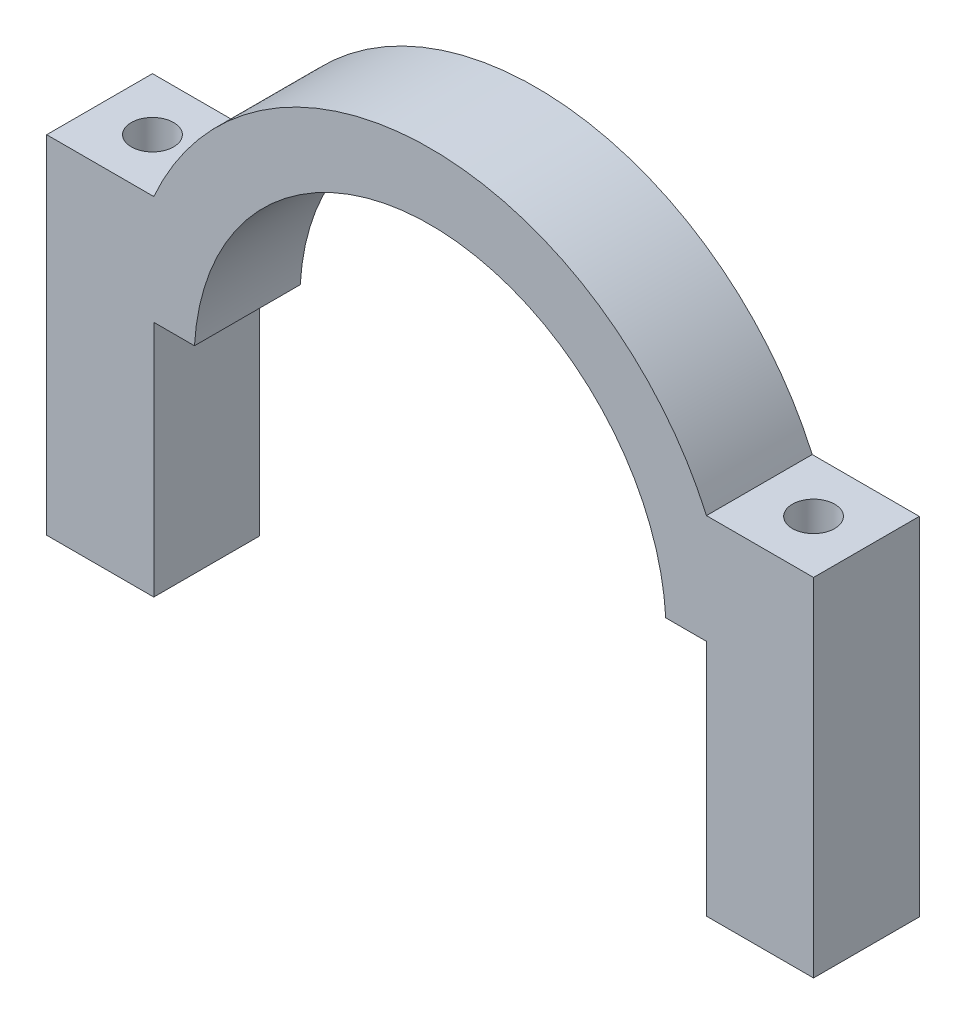
ISO-10303-21;
HEADER;
FILE_DESCRIPTION(('STEP AP214'),'2;1');
FILE_NAME('part.step','',(''),(''),'','','');
FILE_SCHEMA(('AUTOMOTIVE_DESIGN { 1 0 10303 214 1 1 1 1 }'));
ENDSEC;
DATA;
#1=APPLICATION_CONTEXT('core data for automotive mechanical design processes');
#2=APPLICATION_PROTOCOL_DEFINITION('international standard','automotive_design',2000,#1);
#3=PRODUCT_CONTEXT('',#1,'mechanical');
#4=PRODUCT('Part','Part','',(#3));
#5=PRODUCT_RELATED_PRODUCT_CATEGORY('part','',(#4));
#6=PRODUCT_DEFINITION_FORMATION('','',#4);
#7=PRODUCT_DEFINITION_CONTEXT('part definition',#1,'design');
#8=PRODUCT_DEFINITION('design','',#6,#7);
#9=PRODUCT_DEFINITION_SHAPE('','',#8);
#10=(LENGTH_UNIT() NAMED_UNIT(*) SI_UNIT(.MILLI.,.METRE.));
#11=(NAMED_UNIT(*) PLANE_ANGLE_UNIT() SI_UNIT($,.RADIAN.));
#12=(NAMED_UNIT(*) SI_UNIT($,.STERADIAN.) SOLID_ANGLE_UNIT());
#13=UNCERTAINTY_MEASURE_WITH_UNIT(LENGTH_MEASURE(1.E-05),#10,'distance_accuracy_value','');
#14=(GEOMETRIC_REPRESENTATION_CONTEXT(3) GLOBAL_UNCERTAINTY_ASSIGNED_CONTEXT((#13)) GLOBAL_UNIT_ASSIGNED_CONTEXT((#10,
#11,#12)) REPRESENTATION_CONTEXT('',''));
#15=CARTESIAN_POINT('',(0.,0.,0.));
#16=DIRECTION('',(0.,0.,1.));
#17=DIRECTION('',(1.,0.,0.));
#18=AXIS2_PLACEMENT_3D('',#15,#16,#17);
#19=CARTESIAN_POINT('',(0.,0.,8.));
#20=DIRECTION('',(0.,0.,-1.));
#21=DIRECTION('',(-1.,0.,0.));
#22=AXIS2_PLACEMENT_3D('',#19,#20,#21);
#23=CYLINDRICAL_SURFACE('',#22,22.85);
#24=CARTESIAN_POINT('',(0.,0.,0.));
#25=DIRECTION('',(0.,0.,1.));
#26=DIRECTION('',(1.,0.,0.));
#27=AXIS2_PLACEMENT_3D('',#24,#25,#26);
#28=CIRCLE('',#27,22.85);
#29=CARTESIAN_POINT('',(20.9,9.23647660095558,0.));
#30=VERTEX_POINT('',#29);
#31=CARTESIAN_POINT('',(-20.9,9.23647660095558,0.));
#32=VERTEX_POINT('',#31);
#33=EDGE_CURVE('E155',#30,#32,#28,.T.);
#34=ORIENTED_EDGE('',*,*,#33,.T.);
#35=DIRECTION('',(0.,0.,-1.));
#36=VECTOR('',#35,1.);
#37=CARTESIAN_POINT('',(-20.9,9.23647660095558,8.));
#38=LINE('',#37,#36);
#39=CARTESIAN_POINT('',(-20.9,9.23647660095558,8.));
#40=VERTEX_POINT('',#39);
#41=EDGE_CURVE('E11',#40,#32,#38,.T.);
#42=ORIENTED_EDGE('',*,*,#41,.F.);
#43=CARTESIAN_POINT('',(0.,0.,8.));
#44=DIRECTION('',(0.,0.,1.));
#45=DIRECTION('',(1.,0.,0.));
#46=AXIS2_PLACEMENT_3D('',#43,#44,#45);
#47=CIRCLE('',#46,22.85);
#48=CARTESIAN_POINT('',(20.9,9.23647660095558,8.));
#49=VERTEX_POINT('',#48);
#50=EDGE_CURVE('E178',#49,#40,#47,.T.);
#51=ORIENTED_EDGE('',*,*,#50,.F.);
#52=DIRECTION('',(0.,0.,-1.));
#53=VECTOR('',#52,1.);
#54=CARTESIAN_POINT('',(20.9,9.23647660095558,8.));
#55=LINE('',#54,#53);
#56=EDGE_CURVE('E151',#49,#30,#55,.T.);
#57=ORIENTED_EDGE('',*,*,#56,.T.);
#58=EDGE_LOOP('',(#34,#42,#51,#57));
#59=FACE_BOUND('',#58,.T.);
#60=ADVANCED_FACE('F33',(#59),#23,.T.);
#61=CARTESIAN_POINT('',(-20.9,9.23647660095558,8.));
#62=DIRECTION('',(0.,-1.,0.));
#63=DIRECTION('',(1.,0.,0.));
#64=AXIS2_PLACEMENT_3D('',#61,#62,#63);
#65=PLANE('',#64);
#66=CARTESIAN_POINT('',(-25.,9.23647660095558,4.));
#67=DIRECTION('',(0.,-1.,0.));
#68=DIRECTION('',(1.,0.,0.));
#69=AXIS2_PLACEMENT_3D('',#66,#67,#68);
#70=CIRCLE('',#69,1.6);
#71=CARTESIAN_POINT('',(-23.4,9.23647660095558,4.));
#72=VERTEX_POINT('',#71);
#73=EDGE_CURVE('E159',#72,#72,#70,.T.);
#74=ORIENTED_EDGE('',*,*,#73,.T.);
#75=EDGE_LOOP('',(#74));
#76=FACE_BOUND('',#75,.T.);
#77=DIRECTION('',(-1.,0.,0.));
#78=VECTOR('',#77,1.);
#79=CARTESIAN_POINT('',(-20.9,9.23647660095558,0.));
#80=LINE('',#79,#78);
#81=CARTESIAN_POINT('',(-29.,9.23647660095559,0.));
#82=VERTEX_POINT('',#81);
#83=EDGE_CURVE('E158',#32,#82,#80,.T.);
#84=ORIENTED_EDGE('',*,*,#83,.T.);
#85=DIRECTION('',(0.,0.,-1.));
#86=VECTOR('',#85,1.);
#87=CARTESIAN_POINT('',(-29.,9.23647660095559,8.));
#88=LINE('',#87,#86);
#89=CARTESIAN_POINT('',(-29.,9.23647660095559,8.));
#90=VERTEX_POINT('',#89);
#91=EDGE_CURVE('E42',#90,#82,#88,.T.);
#92=ORIENTED_EDGE('',*,*,#91,.F.);
#93=DIRECTION('',(-1.,0.,0.));
#94=VECTOR('',#93,1.);
#95=CARTESIAN_POINT('',(-20.9,9.23647660095558,8.));
#96=LINE('',#95,#94);
#97=EDGE_CURVE('E106',#40,#90,#96,.T.);
#98=ORIENTED_EDGE('',*,*,#97,.F.);
#99=ORIENTED_EDGE('',*,*,#41,.T.);
#100=EDGE_LOOP('',(#84,#92,#98,#99));
#101=FACE_BOUND('',#100,.T.);
#102=ADVANCED_FACE('F255',(#76,#101),#65,.F.);
#103=CARTESIAN_POINT('',(-29.,9.23647660095559,8.));
#104=DIRECTION('',(1.,0.,0.));
#105=DIRECTION('',(0.,1.,0.));
#106=AXIS2_PLACEMENT_3D('',#103,#104,#105);
#107=PLANE('',#106);
#108=DIRECTION('',(0.,-1.,0.));
#109=VECTOR('',#108,1.);
#110=CARTESIAN_POINT('',(-29.,9.23647660095559,0.));
#111=LINE('',#110,#109);
#112=CARTESIAN_POINT('',(-29.,-17.,0.));
#113=VERTEX_POINT('',#112);
#114=EDGE_CURVE('E161',#82,#113,#111,.T.);
#115=ORIENTED_EDGE('',*,*,#114,.T.);
#116=DIRECTION('',(0.,0.,-1.));
#117=VECTOR('',#116,1.);
#118=CARTESIAN_POINT('',(-29.,-17.,8.));
#119=LINE('',#118,#117);
#120=CARTESIAN_POINT('',(-29.,-17.,8.));
#121=VERTEX_POINT('',#120);
#122=EDGE_CURVE('E197',#121,#113,#119,.T.);
#123=ORIENTED_EDGE('',*,*,#122,.F.);
#124=DIRECTION('',(0.,-1.,0.));
#125=VECTOR('',#124,1.);
#126=CARTESIAN_POINT('',(-29.,9.23647660095559,8.));
#127=LINE('',#126,#125);
#128=EDGE_CURVE('E216',#90,#121,#127,.T.);
#129=ORIENTED_EDGE('',*,*,#128,.F.);
#130=ORIENTED_EDGE('',*,*,#91,.T.);
#131=EDGE_LOOP('',(#115,#123,#129,#130));
#132=FACE_BOUND('',#131,.T.);
#133=ADVANCED_FACE('F259',(#132),#107,.F.);
#134=CARTESIAN_POINT('',(-29.,-17.,8.));
#135=DIRECTION('',(0.,1.,0.));
#136=DIRECTION('',(0.,0.,1.));
#137=AXIS2_PLACEMENT_3D('',#134,#135,#136);
#138=PLANE('',#137);
#139=CARTESIAN_POINT('',(-25.,-17.,4.));
#140=DIRECTION('',(0.,1.,0.));
#141=DIRECTION('',(0.,0.,1.));
#142=AXIS2_PLACEMENT_3D('',#139,#140,#141);
#143=CIRCLE('',#142,1.6);
#144=CARTESIAN_POINT('',(-25.,-17.,5.6));
#145=VERTEX_POINT('',#144);
#146=EDGE_CURVE('E36',#145,#145,#143,.T.);
#147=ORIENTED_EDGE('',*,*,#146,.T.);
#148=EDGE_LOOP('',(#147));
#149=FACE_BOUND('',#148,.T.);
#150=DIRECTION('',(1.,0.,0.));
#151=VECTOR('',#150,1.);
#152=CARTESIAN_POINT('',(-29.,-17.,0.));
#153=LINE('',#152,#151);
#154=CARTESIAN_POINT('',(-20.9,-17.,0.));
#155=VERTEX_POINT('',#154);
#156=EDGE_CURVE('E163',#113,#155,#153,.T.);
#157=ORIENTED_EDGE('',*,*,#156,.T.);
#158=DIRECTION('',(0.,0.,-1.));
#159=VECTOR('',#158,1.);
#160=CARTESIAN_POINT('',(-20.9,-17.,8.));
#161=LINE('',#160,#159);
#162=CARTESIAN_POINT('',(-20.9,-17.,8.));
#163=VERTEX_POINT('',#162);
#164=EDGE_CURVE('E194',#163,#155,#161,.T.);
#165=ORIENTED_EDGE('',*,*,#164,.F.);
#166=DIRECTION('',(1.,0.,0.));
#167=VECTOR('',#166,1.);
#168=CARTESIAN_POINT('',(-29.,-17.,8.));
#169=LINE('',#168,#167);
#170=EDGE_CURVE('E218',#121,#163,#169,.T.);
#171=ORIENTED_EDGE('',*,*,#170,.F.);
#172=ORIENTED_EDGE('',*,*,#122,.T.);
#173=EDGE_LOOP('',(#157,#165,#171,#172));
#174=FACE_BOUND('',#173,.T.);
#175=ADVANCED_FACE('F264',(#149,#174),#138,.F.);
#176=CARTESIAN_POINT('',(-20.9,-17.,8.));
#177=DIRECTION('',(-1.,0.,0.));
#178=DIRECTION('',(0.,0.,1.));
#179=AXIS2_PLACEMENT_3D('',#176,#177,#178);
#180=PLANE('',#179);
#181=DIRECTION('',(0.,1.,0.));
#182=VECTOR('',#181,1.);
#183=CARTESIAN_POINT('',(-20.9,-17.,0.));
#184=LINE('',#183,#182);
#185=CARTESIAN_POINT('',(-20.9,1.,0.));
#186=VERTEX_POINT('',#185);
#187=EDGE_CURVE('E165',#155,#186,#184,.T.);
#188=ORIENTED_EDGE('',*,*,#187,.T.);
#189=DIRECTION('',(0.,0.,-1.));
#190=VECTOR('',#189,1.);
#191=CARTESIAN_POINT('',(-20.9,1.,8.));
#192=LINE('',#191,#190);
#193=CARTESIAN_POINT('',(-20.9,1.,8.));
#194=VERTEX_POINT('',#193);
#195=EDGE_CURVE('E191',#194,#186,#192,.T.);
#196=ORIENTED_EDGE('',*,*,#195,.F.);
#197=DIRECTION('',(0.,1.,0.));
#198=VECTOR('',#197,1.);
#199=CARTESIAN_POINT('',(-20.9,-17.,8.));
#200=LINE('',#199,#198);
#201=EDGE_CURVE('E220',#163,#194,#200,.T.);
#202=ORIENTED_EDGE('',*,*,#201,.F.);
#203=ORIENTED_EDGE('',*,*,#164,.T.);
#204=EDGE_LOOP('',(#188,#196,#202,#203));
#205=FACE_BOUND('',#204,.T.);
#206=ADVANCED_FACE('F270',(#205),#180,.F.);
#207=CARTESIAN_POINT('',(-20.9,1.,8.));
#208=DIRECTION('',(0.,1.,0.));
#209=DIRECTION('',(0.,0.,1.));
#210=AXIS2_PLACEMENT_3D('',#207,#208,#209);
#211=PLANE('',#210);
#212=DIRECTION('',(1.,0.,0.));
#213=VECTOR('',#212,1.);
#214=CARTESIAN_POINT('',(-20.9,1.,0.));
#215=LINE('',#214,#213);
#216=CARTESIAN_POINT('',(-17.8219667825973,1.,0.));
#217=VERTEX_POINT('',#216);
#218=EDGE_CURVE('E167',#186,#217,#215,.T.);
#219=ORIENTED_EDGE('',*,*,#218,.T.);
#220=DIRECTION('',(0.,0.,-1.));
#221=VECTOR('',#220,1.);
#222=CARTESIAN_POINT('',(-17.8219667825973,1.,8.));
#223=LINE('',#222,#221);
#224=CARTESIAN_POINT('',(-17.8219667825973,1.,8.));
#225=VERTEX_POINT('',#224);
#226=EDGE_CURVE('E188',#225,#217,#223,.T.);
#227=ORIENTED_EDGE('',*,*,#226,.F.);
#228=DIRECTION('',(1.,0.,0.));
#229=VECTOR('',#228,1.);
#230=CARTESIAN_POINT('',(-20.9,1.,8.));
#231=LINE('',#230,#229);
#232=EDGE_CURVE('E222',#194,#225,#231,.T.);
#233=ORIENTED_EDGE('',*,*,#232,.F.);
#234=ORIENTED_EDGE('',*,*,#195,.T.);
#235=EDGE_LOOP('',(#219,#227,#233,#234));
#236=FACE_BOUND('',#235,.T.);
#237=ADVANCED_FACE('F274',(#236),#211,.F.);
#238=CARTESIAN_POINT('',(0.,0.,8.));
#239=DIRECTION('',(0.,0.,-1.));
#240=DIRECTION('',(-1.,0.,0.));
#241=AXIS2_PLACEMENT_3D('',#238,#239,#240);
#242=CYLINDRICAL_SURFACE('',#241,17.85);
#243=CARTESIAN_POINT('',(0.,0.,0.));
#244=DIRECTION('',(0.,0.,-1.));
#245=DIRECTION('',(-1.,0.,0.));
#246=AXIS2_PLACEMENT_3D('',#243,#244,#245);
#247=CIRCLE('',#246,17.85);
#248=CARTESIAN_POINT('',(17.8219667825973,1.,0.));
#249=VERTEX_POINT('',#248);
#250=EDGE_CURVE('E169',#217,#249,#247,.T.);
#251=ORIENTED_EDGE('',*,*,#250,.T.);
#252=DIRECTION('',(0.,0.,-1.));
#253=VECTOR('',#252,1.);
#254=CARTESIAN_POINT('',(17.8219667825973,1.,8.));
#255=LINE('',#254,#253);
#256=CARTESIAN_POINT('',(17.8219667825973,1.,8.));
#257=VERTEX_POINT('',#256);
#258=EDGE_CURVE('E185',#257,#249,#255,.T.);
#259=ORIENTED_EDGE('',*,*,#258,.F.);
#260=CARTESIAN_POINT('',(0.,0.,8.));
#261=DIRECTION('',(0.,0.,-1.));
#262=DIRECTION('',(-1.,0.,0.));
#263=AXIS2_PLACEMENT_3D('',#260,#261,#262);
#264=CIRCLE('',#263,17.85);
#265=EDGE_CURVE('E224',#225,#257,#264,.T.);
#266=ORIENTED_EDGE('',*,*,#265,.F.);
#267=ORIENTED_EDGE('',*,*,#226,.T.);
#268=EDGE_LOOP('',(#251,#259,#266,#267));
#269=FACE_BOUND('',#268,.T.);
#270=ADVANCED_FACE('F278',(#269),#242,.F.);
#271=CARTESIAN_POINT('',(17.8219667825973,1.,8.));
#272=DIRECTION('',(0.,1.,0.));
#273=DIRECTION('',(0.,0.,1.));
#274=AXIS2_PLACEMENT_3D('',#271,#272,#273);
#275=PLANE('',#274);
#276=DIRECTION('',(1.,0.,0.));
#277=VECTOR('',#276,1.);
#278=CARTESIAN_POINT('',(17.8219667825973,1.,0.));
#279=LINE('',#278,#277);
#280=CARTESIAN_POINT('',(20.9,1.,0.));
#281=VERTEX_POINT('',#280);
#282=EDGE_CURVE('E171',#249,#281,#279,.T.);
#283=ORIENTED_EDGE('',*,*,#282,.T.);
#284=DIRECTION('',(0.,0.,-1.));
#285=VECTOR('',#284,1.);
#286=CARTESIAN_POINT('',(20.9,1.,8.));
#287=LINE('',#286,#285);
#288=CARTESIAN_POINT('',(20.9,1.,8.));
#289=VERTEX_POINT('',#288);
#290=EDGE_CURVE('E182',#289,#281,#287,.T.);
#291=ORIENTED_EDGE('',*,*,#290,.F.);
#292=DIRECTION('',(1.,0.,0.));
#293=VECTOR('',#292,1.);
#294=CARTESIAN_POINT('',(17.8219667825973,1.,8.));
#295=LINE('',#294,#293);
#296=EDGE_CURVE('E226',#257,#289,#295,.T.);
#297=ORIENTED_EDGE('',*,*,#296,.F.);
#298=ORIENTED_EDGE('',*,*,#258,.T.);
#299=EDGE_LOOP('',(#283,#291,#297,#298));
#300=FACE_BOUND('',#299,.T.);
#301=ADVANCED_FACE('F232',(#300),#275,.F.);
#302=CARTESIAN_POINT('',(20.9,1.,8.));
#303=DIRECTION('',(1.,0.,0.));
#304=DIRECTION('',(0.,0.,-1.));
#305=AXIS2_PLACEMENT_3D('',#302,#303,#304);
#306=PLANE('',#305);
#307=DIRECTION('',(0.,-1.,0.));
#308=VECTOR('',#307,1.);
#309=CARTESIAN_POINT('',(20.9,1.,0.));
#310=LINE('',#309,#308);
#311=CARTESIAN_POINT('',(20.9,-17.,0.));
#312=VERTEX_POINT('',#311);
#313=EDGE_CURVE('E173',#281,#312,#310,.T.);
#314=ORIENTED_EDGE('',*,*,#313,.T.);
#315=DIRECTION('',(0.,0.,-1.));
#316=VECTOR('',#315,1.);
#317=CARTESIAN_POINT('',(20.9,-17.,8.));
#318=LINE('',#317,#316);
#319=CARTESIAN_POINT('',(20.9,-17.,8.));
#320=VERTEX_POINT('',#319);
#321=EDGE_CURVE('E146',#320,#312,#318,.T.);
#322=ORIENTED_EDGE('',*,*,#321,.F.);
#323=DIRECTION('',(0.,-1.,0.));
#324=VECTOR('',#323,1.);
#325=CARTESIAN_POINT('',(20.9,1.,8.));
#326=LINE('',#325,#324);
#327=EDGE_CURVE('E137',#289,#320,#326,.T.);
#328=ORIENTED_EDGE('',*,*,#327,.F.);
#329=ORIENTED_EDGE('',*,*,#290,.T.);
#330=EDGE_LOOP('',(#314,#322,#328,#329));
#331=FACE_BOUND('',#330,.T.);
#332=ADVANCED_FACE('F236',(#331),#306,.F.);
#333=CARTESIAN_POINT('',(20.9,-17.,8.));
#334=DIRECTION('',(0.,1.,0.));
#335=DIRECTION('',(0.,0.,1.));
#336=AXIS2_PLACEMENT_3D('',#333,#334,#335);
#337=PLANE('',#336);
#338=CARTESIAN_POINT('',(25.,-17.,4.));
#339=DIRECTION('',(0.,1.,0.));
#340=DIRECTION('',(0.,0.,1.));
#341=AXIS2_PLACEMENT_3D('',#338,#339,#340);
#342=CIRCLE('',#341,1.6);
#343=CARTESIAN_POINT('',(25.,-17.,5.6));
#344=VERTEX_POINT('',#343);
#345=EDGE_CURVE('E203',#344,#344,#342,.T.);
#346=ORIENTED_EDGE('',*,*,#345,.T.);
#347=EDGE_LOOP('',(#346));
#348=FACE_BOUND('',#347,.T.);
#349=DIRECTION('',(1.,0.,0.));
#350=VECTOR('',#349,1.);
#351=CARTESIAN_POINT('',(20.9,-17.,0.));
#352=LINE('',#351,#350);
#353=CARTESIAN_POINT('',(29.,-17.,0.));
#354=VERTEX_POINT('',#353);
#355=EDGE_CURVE('E145',#312,#354,#352,.T.);
#356=ORIENTED_EDGE('',*,*,#355,.T.);
#357=DIRECTION('',(0.,0.,-1.));
#358=VECTOR('',#357,1.);
#359=CARTESIAN_POINT('',(29.,-17.,8.));
#360=LINE('',#359,#358);
#361=CARTESIAN_POINT('',(29.,-17.,8.));
#362=VERTEX_POINT('',#361);
#363=EDGE_CURVE('E142',#362,#354,#360,.T.);
#364=ORIENTED_EDGE('',*,*,#363,.F.);
#365=DIRECTION('',(1.,0.,0.));
#366=VECTOR('',#365,1.);
#367=CARTESIAN_POINT('',(20.9,-17.,8.));
#368=LINE('',#367,#366);
#369=EDGE_CURVE('E131',#320,#362,#368,.T.);
#370=ORIENTED_EDGE('',*,*,#369,.F.);
#371=ORIENTED_EDGE('',*,*,#321,.T.);
#372=EDGE_LOOP('',(#356,#364,#370,#371));
#373=FACE_BOUND('',#372,.T.);
#374=ADVANCED_FACE('F143',(#348,#373),#337,.F.);
#375=CARTESIAN_POINT('',(29.,-17.,8.));
#376=DIRECTION('',(-1.,0.,0.));
#377=DIRECTION('',(0.,-1.,0.));
#378=AXIS2_PLACEMENT_3D('',#375,#376,#377);
#379=PLANE('',#378);
#380=DIRECTION('',(0.,1.,0.));
#381=VECTOR('',#380,1.);
#382=CARTESIAN_POINT('',(29.,-17.,0.));
#383=LINE('',#382,#381);
#384=CARTESIAN_POINT('',(29.,9.23647660095559,0.));
#385=VERTEX_POINT('',#384);
#386=EDGE_CURVE('E92',#354,#385,#383,.T.);
#387=ORIENTED_EDGE('',*,*,#386,.T.);
#388=DIRECTION('',(0.,0.,-1.));
#389=VECTOR('',#388,1.);
#390=CARTESIAN_POINT('',(29.,9.23647660095559,8.));
#391=LINE('',#390,#389);
#392=CARTESIAN_POINT('',(29.,9.23647660095559,8.));
#393=VERTEX_POINT('',#392);
#394=EDGE_CURVE('E147',#393,#385,#391,.T.);
#395=ORIENTED_EDGE('',*,*,#394,.F.);
#396=DIRECTION('',(0.,1.,0.));
#397=VECTOR('',#396,1.);
#398=CARTESIAN_POINT('',(29.,-17.,8.));
#399=LINE('',#398,#397);
#400=EDGE_CURVE('E135',#362,#393,#399,.T.);
#401=ORIENTED_EDGE('',*,*,#400,.F.);
#402=ORIENTED_EDGE('',*,*,#363,.T.);
#403=EDGE_LOOP('',(#387,#395,#401,#402));
#404=FACE_BOUND('',#403,.T.);
#405=ADVANCED_FACE('F149',(#404),#379,.F.);
#406=CARTESIAN_POINT('',(29.,9.23647660095559,8.));
#407=DIRECTION('',(0.,-1.,0.));
#408=DIRECTION('',(1.,0.,0.));
#409=AXIS2_PLACEMENT_3D('',#406,#407,#408);
#410=PLANE('',#409);
#411=CARTESIAN_POINT('',(25.,9.23647660095558,4.));
#412=DIRECTION('',(0.,-1.,0.));
#413=DIRECTION('',(1.,0.,0.));
#414=AXIS2_PLACEMENT_3D('',#411,#412,#413);
#415=CIRCLE('',#414,1.6);
#416=CARTESIAN_POINT('',(26.6,9.23647660095559,4.));
#417=VERTEX_POINT('',#416);
#418=EDGE_CURVE('E201',#417,#417,#415,.T.);
#419=ORIENTED_EDGE('',*,*,#418,.T.);
#420=EDGE_LOOP('',(#419));
#421=FACE_BOUND('',#420,.T.);
#422=DIRECTION('',(-1.,0.,0.));
#423=VECTOR('',#422,1.);
#424=CARTESIAN_POINT('',(29.,9.23647660095559,0.));
#425=LINE('',#424,#423);
#426=EDGE_CURVE('E98',#385,#30,#425,.T.);
#427=ORIENTED_EDGE('',*,*,#426,.T.);
#428=ORIENTED_EDGE('',*,*,#56,.F.);
#429=DIRECTION('',(-1.,0.,0.));
#430=VECTOR('',#429,1.);
#431=CARTESIAN_POINT('',(29.,9.23647660095559,8.));
#432=LINE('',#431,#430);
#433=EDGE_CURVE('E51',#393,#49,#432,.T.);
#434=ORIENTED_EDGE('',*,*,#433,.F.);
#435=ORIENTED_EDGE('',*,*,#394,.T.);
#436=EDGE_LOOP('',(#427,#428,#434,#435));
#437=FACE_BOUND('',#436,.T.);
#438=ADVANCED_FACE('F244',(#421,#437),#410,.F.);
#439=CARTESIAN_POINT('',(0.,0.,8.));
#440=DIRECTION('',(0.,0.,1.));
#441=DIRECTION('',(1.,0.,0.));
#442=AXIS2_PLACEMENT_3D('',#439,#440,#441);
#443=PLANE('',#442);
#444=ORIENTED_EDGE('',*,*,#50,.T.);
#445=ORIENTED_EDGE('',*,*,#97,.T.);
#446=ORIENTED_EDGE('',*,*,#128,.T.);
#447=ORIENTED_EDGE('',*,*,#170,.T.);
#448=ORIENTED_EDGE('',*,*,#201,.T.);
#449=ORIENTED_EDGE('',*,*,#232,.T.);
#450=ORIENTED_EDGE('',*,*,#265,.T.);
#451=ORIENTED_EDGE('',*,*,#296,.T.);
#452=ORIENTED_EDGE('',*,*,#327,.T.);
#453=ORIENTED_EDGE('',*,*,#369,.T.);
#454=ORIENTED_EDGE('',*,*,#400,.T.);
#455=ORIENTED_EDGE('',*,*,#433,.T.);
#456=EDGE_LOOP('',(#444,#445,#446,#447,#448,#449,#450,#451,#452,#453,#454,#455));
#457=FACE_BOUND('',#456,.T.);
#458=ADVANCED_FACE('F133',(#457),#443,.T.);
#459=CARTESIAN_POINT('',(0.,0.,0.));
#460=DIRECTION('',(0.,0.,1.));
#461=DIRECTION('',(1.,0.,0.));
#462=AXIS2_PLACEMENT_3D('',#459,#460,#461);
#463=PLANE('',#462);
#464=ORIENTED_EDGE('',*,*,#33,.F.);
#465=ORIENTED_EDGE('',*,*,#426,.F.);
#466=ORIENTED_EDGE('',*,*,#386,.F.);
#467=ORIENTED_EDGE('',*,*,#355,.F.);
#468=ORIENTED_EDGE('',*,*,#313,.F.);
#469=ORIENTED_EDGE('',*,*,#282,.F.);
#470=ORIENTED_EDGE('',*,*,#250,.F.);
#471=ORIENTED_EDGE('',*,*,#218,.F.);
#472=ORIENTED_EDGE('',*,*,#187,.F.);
#473=ORIENTED_EDGE('',*,*,#156,.F.);
#474=ORIENTED_EDGE('',*,*,#114,.F.);
#475=ORIENTED_EDGE('',*,*,#83,.F.);
#476=EDGE_LOOP('',(#464,#465,#466,#467,#468,#469,#470,#471,#472,#473,#474,#475));
#477=FACE_BOUND('',#476,.T.);
#478=ADVANCED_FACE('F239',(#477),#463,.F.);
#479=CARTESIAN_POINT('',(25.,22.85,4.));
#480=DIRECTION('',(0.,-1.,0.));
#481=DIRECTION('',(0.,0.,-1.));
#482=AXIS2_PLACEMENT_3D('',#479,#480,#481);
#483=CYLINDRICAL_SURFACE('',#482,1.6);
#484=ORIENTED_EDGE('',*,*,#418,.F.);
#485=EDGE_LOOP('',(#484));
#486=FACE_BOUND('',#485,.T.);
#487=ORIENTED_EDGE('',*,*,#345,.F.);
#488=EDGE_LOOP('',(#487));
#489=FACE_BOUND('',#488,.T.);
#490=ADVANCED_FACE('F315',(#486,#489),#483,.F.);
#491=CARTESIAN_POINT('',(-25.,22.85,4.));
#492=DIRECTION('',(0.,-1.,0.));
#493=DIRECTION('',(0.,0.,-1.));
#494=AXIS2_PLACEMENT_3D('',#491,#492,#493);
#495=CYLINDRICAL_SURFACE('',#494,1.6);
#496=ORIENTED_EDGE('',*,*,#146,.F.);
#497=EDGE_LOOP('',(#496));
#498=FACE_BOUND('',#497,.T.);
#499=ORIENTED_EDGE('',*,*,#73,.F.);
#500=EDGE_LOOP('',(#499));
#501=FACE_BOUND('',#500,.T.);
#502=ADVANCED_FACE('F370',(#498,#501),#495,.F.);
#503=CLOSED_SHELL('',(#60,#102,#133,#175,#206,#237,#270,#301,#332,#374,#405,#438,#458,#478,#490,#502));
#504=MANIFOLD_SOLID_BREP('B2',#503);
#505=ADVANCED_BREP_SHAPE_REPRESENTATION('',(#18,#504),#14);
#506=SHAPE_DEFINITION_REPRESENTATION(#9,#505);
ENDSEC;
END-ISO-10303-21;
